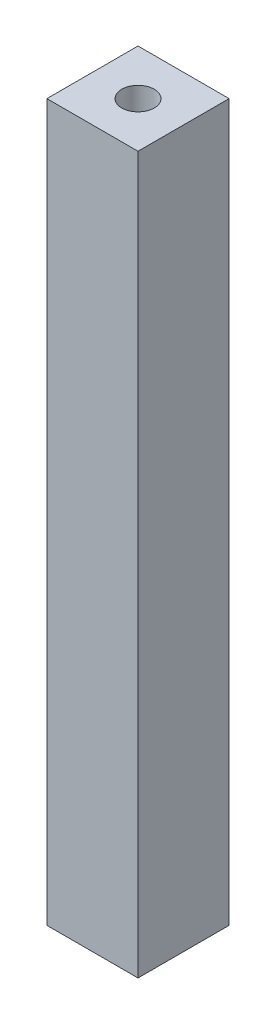
ISO-10303-21;
HEADER;
FILE_DESCRIPTION(('STEP AP214'),'2;1');
FILE_NAME('part.step','',(''),(''),'','','');
FILE_SCHEMA(('AUTOMOTIVE_DESIGN { 1 0 10303 214 1 1 1 1 }'));
ENDSEC;
DATA;
#1=APPLICATION_CONTEXT('core data for automotive mechanical design processes');
#2=APPLICATION_PROTOCOL_DEFINITION('international standard','automotive_design',2000,#1);
#3=PRODUCT_CONTEXT('',#1,'mechanical');
#4=PRODUCT('Part','Part','',(#3));
#5=PRODUCT_RELATED_PRODUCT_CATEGORY('part','',(#4));
#6=PRODUCT_DEFINITION_FORMATION('','',#4);
#7=PRODUCT_DEFINITION_CONTEXT('part definition',#1,'design');
#8=PRODUCT_DEFINITION('design','',#6,#7);
#9=PRODUCT_DEFINITION_SHAPE('','',#8);
#10=(LENGTH_UNIT() NAMED_UNIT(*) SI_UNIT(.MILLI.,.METRE.));
#11=(NAMED_UNIT(*) PLANE_ANGLE_UNIT() SI_UNIT($,.RADIAN.));
#12=(NAMED_UNIT(*) SI_UNIT($,.STERADIAN.) SOLID_ANGLE_UNIT());
#13=UNCERTAINTY_MEASURE_WITH_UNIT(LENGTH_MEASURE(1.E-05),#10,'distance_accuracy_value','');
#14=(GEOMETRIC_REPRESENTATION_CONTEXT(3) GLOBAL_UNCERTAINTY_ASSIGNED_CONTEXT((#13)) GLOBAL_UNIT_ASSIGNED_CONTEXT((#10,
#11,#12)) REPRESENTATION_CONTEXT('',''));
#15=CARTESIAN_POINT('',(0.,0.,0.));
#16=DIRECTION('',(0.,0.,1.));
#17=DIRECTION('',(1.,0.,0.));
#18=AXIS2_PLACEMENT_3D('',#15,#16,#17);
#19=CARTESIAN_POINT('',(0.,55.,-3.5));
#20=DIRECTION('',(0.,0.,1.));
#21=DIRECTION('',(1.,0.,0.));
#22=AXIS2_PLACEMENT_3D('',#19,#20,#21);
#23=PLANE('',#22);
#24=DIRECTION('',(-1.,0.,0.));
#25=VECTOR('',#24,1.);
#26=CARTESIAN_POINT('',(0.,0.,-3.5));
#27=LINE('',#26,#25);
#28=CARTESIAN_POINT('',(3.5,0.,-3.5));
#29=VERTEX_POINT('',#28);
#30=CARTESIAN_POINT('',(-3.5,0.,-3.5));
#31=VERTEX_POINT('',#30);
#32=EDGE_CURVE('E80',#29,#31,#27,.T.);
#33=ORIENTED_EDGE('',*,*,#32,.T.);
#34=DIRECTION('',(0.,-1.,0.));
#35=VECTOR('',#34,1.);
#36=CARTESIAN_POINT('',(-3.5,55.,-3.5));
#37=LINE('',#36,#35);
#38=CARTESIAN_POINT('',(-3.5,55.,-3.5));
#39=VERTEX_POINT('',#38);
#40=EDGE_CURVE('E11',#39,#31,#37,.T.);
#41=ORIENTED_EDGE('',*,*,#40,.F.);
#42=DIRECTION('',(-1.,0.,0.));
#43=VECTOR('',#42,1.);
#44=CARTESIAN_POINT('',(3.5,55.,-3.5));
#45=LINE('',#44,#43);
#46=CARTESIAN_POINT('',(3.5,55.,-3.5));
#47=VERTEX_POINT('',#46);
#48=EDGE_CURVE('E85',#47,#39,#45,.T.);
#49=ORIENTED_EDGE('',*,*,#48,.F.);
#50=DIRECTION('',(0.,-1.,0.));
#51=VECTOR('',#50,1.);
#52=CARTESIAN_POINT('',(3.5,55.,-3.5));
#53=LINE('',#52,#51);
#54=EDGE_CURVE('E104',#47,#29,#53,.T.);
#55=ORIENTED_EDGE('',*,*,#54,.T.);
#56=EDGE_LOOP('',(#33,#41,#49,#55));
#57=FACE_BOUND('',#56,.T.);
#58=ADVANCED_FACE('F39',(#57),#23,.F.);
#59=CARTESIAN_POINT('',(-3.5,55.,-3.5));
#60=DIRECTION('',(1.,0.,0.));
#61=DIRECTION('',(0.,0.,-1.));
#62=AXIS2_PLACEMENT_3D('',#59,#60,#61);
#63=PLANE('',#62);
#64=DIRECTION('',(0.,0.,1.));
#65=VECTOR('',#64,1.);
#66=CARTESIAN_POINT('',(-3.5,0.,-3.5));
#67=LINE('',#66,#65);
#68=CARTESIAN_POINT('',(-3.5,0.,3.5));
#69=VERTEX_POINT('',#68);
#70=EDGE_CURVE('E97',#31,#69,#67,.T.);
#71=ORIENTED_EDGE('',*,*,#70,.T.);
#72=DIRECTION('',(0.,-1.,0.));
#73=VECTOR('',#72,1.);
#74=CARTESIAN_POINT('',(-3.5,55.,3.5));
#75=LINE('',#74,#73);
#76=CARTESIAN_POINT('',(-3.5,55.,3.5));
#77=VERTEX_POINT('',#76);
#78=EDGE_CURVE('E48',#77,#69,#75,.T.);
#79=ORIENTED_EDGE('',*,*,#78,.F.);
#80=DIRECTION('',(0.,0.,1.));
#81=VECTOR('',#80,1.);
#82=CARTESIAN_POINT('',(-3.5,55.,-3.5));
#83=LINE('',#82,#81);
#84=EDGE_CURVE('E88',#39,#77,#83,.T.);
#85=ORIENTED_EDGE('',*,*,#84,.F.);
#86=ORIENTED_EDGE('',*,*,#40,.T.);
#87=EDGE_LOOP('',(#71,#79,#85,#86));
#88=FACE_BOUND('',#87,.T.);
#89=ADVANCED_FACE('F96',(#88),#63,.F.);
#90=CARTESIAN_POINT('',(-3.5,55.,3.5));
#91=DIRECTION('',(0.,0.,-1.));
#92=DIRECTION('',(-1.,0.,0.));
#93=AXIS2_PLACEMENT_3D('',#90,#91,#92);
#94=PLANE('',#93);
#95=DIRECTION('',(1.,0.,0.));
#96=VECTOR('',#95,1.);
#97=CARTESIAN_POINT('',(-3.5,0.,3.5));
#98=LINE('',#97,#96);
#99=CARTESIAN_POINT('',(3.5,0.,3.5));
#100=VERTEX_POINT('',#99);
#101=EDGE_CURVE('E73',#69,#100,#98,.T.);
#102=ORIENTED_EDGE('',*,*,#101,.T.);
#103=DIRECTION('',(0.,-1.,0.));
#104=VECTOR('',#103,1.);
#105=CARTESIAN_POINT('',(3.5,55.,3.5));
#106=LINE('',#105,#104);
#107=CARTESIAN_POINT('',(3.5,55.,3.5));
#108=VERTEX_POINT('',#107);
#109=EDGE_CURVE('E99',#108,#100,#106,.T.);
#110=ORIENTED_EDGE('',*,*,#109,.F.);
#111=DIRECTION('',(1.,0.,0.));
#112=VECTOR('',#111,1.);
#113=CARTESIAN_POINT('',(-3.5,55.,3.5));
#114=LINE('',#113,#112);
#115=EDGE_CURVE('E92',#77,#108,#114,.T.);
#116=ORIENTED_EDGE('',*,*,#115,.F.);
#117=ORIENTED_EDGE('',*,*,#78,.T.);
#118=EDGE_LOOP('',(#102,#110,#116,#117));
#119=FACE_BOUND('',#118,.T.);
#120=ADVANCED_FACE('F100',(#119),#94,.F.);
#121=CARTESIAN_POINT('',(3.5,55.,3.5));
#122=DIRECTION('',(-1.,0.,0.));
#123=DIRECTION('',(0.,0.,1.));
#124=AXIS2_PLACEMENT_3D('',#121,#122,#123);
#125=PLANE('',#124);
#126=DIRECTION('',(0.,0.,-1.));
#127=VECTOR('',#126,1.);
#128=CARTESIAN_POINT('',(3.5,0.,3.5));
#129=LINE('',#128,#127);
#130=EDGE_CURVE('E115',#100,#29,#129,.T.);
#131=ORIENTED_EDGE('',*,*,#130,.T.);
#132=ORIENTED_EDGE('',*,*,#54,.F.);
#133=DIRECTION('',(0.,0.,-1.));
#134=VECTOR('',#133,1.);
#135=CARTESIAN_POINT('',(3.5,55.,3.5));
#136=LINE('',#135,#134);
#137=EDGE_CURVE('E56',#108,#47,#136,.T.);
#138=ORIENTED_EDGE('',*,*,#137,.F.);
#139=ORIENTED_EDGE('',*,*,#109,.T.);
#140=EDGE_LOOP('',(#131,#132,#138,#139));
#141=FACE_BOUND('',#140,.T.);
#142=ADVANCED_FACE('F123',(#141),#125,.F.);
#143=CARTESIAN_POINT('',(0.,55.,0.));
#144=DIRECTION('',(0.,1.,0.));
#145=DIRECTION('',(0.,0.,1.));
#146=AXIS2_PLACEMENT_3D('',#143,#144,#145);
#147=PLANE('',#146);
#148=CARTESIAN_POINT('',(0.,55.,0.));
#149=DIRECTION('',(0.,1.,0.));
#150=DIRECTION('',(0.,0.,1.));
#151=AXIS2_PLACEMENT_3D('',#148,#149,#150);
#152=CIRCLE('',#151,1.25);
#153=CARTESIAN_POINT('',(0.,55.,1.25));
#154=VERTEX_POINT('',#153);
#155=EDGE_CURVE('E147',#154,#154,#152,.T.);
#156=ORIENTED_EDGE('',*,*,#155,.F.);
#157=EDGE_LOOP('',(#156));
#158=FACE_BOUND('',#157,.T.);
#159=ORIENTED_EDGE('',*,*,#48,.T.);
#160=ORIENTED_EDGE('',*,*,#84,.T.);
#161=ORIENTED_EDGE('',*,*,#115,.T.);
#162=ORIENTED_EDGE('',*,*,#137,.T.);
#163=EDGE_LOOP('',(#159,#160,#161,#162));
#164=FACE_BOUND('',#163,.T.);
#165=ADVANCED_FACE('F90',(#158,#164),#147,.T.);
#166=CARTESIAN_POINT('',(0.,0.,0.));
#167=DIRECTION('',(0.,1.,0.));
#168=DIRECTION('',(0.,0.,1.));
#169=AXIS2_PLACEMENT_3D('',#166,#167,#168);
#170=PLANE('',#169);
#171=CARTESIAN_POINT('',(0.,0.,0.));
#172=DIRECTION('',(0.,-1.,0.));
#173=DIRECTION('',(0.,0.,-1.));
#174=AXIS2_PLACEMENT_3D('',#171,#172,#173);
#175=CIRCLE('',#174,1.25);
#176=CARTESIAN_POINT('',(0.,0.,-1.25));
#177=VERTEX_POINT('',#176);
#178=EDGE_CURVE('E155',#177,#177,#175,.T.);
#179=ORIENTED_EDGE('',*,*,#178,.F.);
#180=EDGE_LOOP('',(#179));
#181=FACE_BOUND('',#180,.T.);
#182=ORIENTED_EDGE('',*,*,#32,.F.);
#183=ORIENTED_EDGE('',*,*,#130,.F.);
#184=ORIENTED_EDGE('',*,*,#101,.F.);
#185=ORIENTED_EDGE('',*,*,#70,.F.);
#186=EDGE_LOOP('',(#182,#183,#184,#185));
#187=FACE_BOUND('',#186,.T.);
#188=ADVANCED_FACE('F124',(#181,#187),#170,.F.);
#189=CARTESIAN_POINT('',(0.,43.,0.));
#190=DIRECTION('',(0.,1.,0.));
#191=DIRECTION('',(0.,0.,1.));
#192=AXIS2_PLACEMENT_3D('',#189,#190,#191);
#193=CYLINDRICAL_SURFACE('',#192,1.25);
#194=CARTESIAN_POINT('',(0.,43.,0.));
#195=DIRECTION('',(0.,1.,0.));
#196=DIRECTION('',(0.,0.,1.));
#197=AXIS2_PLACEMENT_3D('',#194,#195,#196);
#198=CIRCLE('',#197,1.25);
#199=CARTESIAN_POINT('',(0.,43.,1.25));
#200=VERTEX_POINT('',#199);
#201=EDGE_CURVE('E110',#200,#200,#198,.T.);
#202=ORIENTED_EDGE('',*,*,#201,.F.);
#203=EDGE_LOOP('',(#202));
#204=FACE_BOUND('',#203,.T.);
#205=ORIENTED_EDGE('',*,*,#155,.T.);
#206=EDGE_LOOP('',(#205));
#207=FACE_BOUND('',#206,.T.);
#208=ADVANCED_FACE('F126',(#204,#207),#193,.F.);
#209=CARTESIAN_POINT('',(0.,43.,0.));
#210=DIRECTION('',(0.,1.,0.));
#211=DIRECTION('',(0.,0.,1.));
#212=AXIS2_PLACEMENT_3D('',#209,#210,#211);
#213=PLANE('',#212);
#214=ORIENTED_EDGE('',*,*,#201,.T.);
#215=EDGE_LOOP('',(#214));
#216=FACE_BOUND('',#215,.T.);
#217=ADVANCED_FACE('F133',(#216),#213,.T.);
#218=CARTESIAN_POINT('',(0.,12.,0.));
#219=DIRECTION('',(0.,-1.,0.));
#220=DIRECTION('',(0.,0.,-1.));
#221=AXIS2_PLACEMENT_3D('',#218,#219,#220);
#222=CYLINDRICAL_SURFACE('',#221,1.25);
#223=CARTESIAN_POINT('',(0.,12.,0.));
#224=DIRECTION('',(0.,-1.,0.));
#225=DIRECTION('',(0.,0.,-1.));
#226=AXIS2_PLACEMENT_3D('',#223,#224,#225);
#227=CIRCLE('',#226,1.25);
#228=CARTESIAN_POINT('',(0.,12.,-1.25));
#229=VERTEX_POINT('',#228);
#230=EDGE_CURVE('E151',#229,#229,#227,.T.);
#231=ORIENTED_EDGE('',*,*,#230,.F.);
#232=EDGE_LOOP('',(#231));
#233=FACE_BOUND('',#232,.T.);
#234=ORIENTED_EDGE('',*,*,#178,.T.);
#235=EDGE_LOOP('',(#234));
#236=FACE_BOUND('',#235,.T.);
#237=ADVANCED_FACE('F165',(#233,#236),#222,.F.);
#238=CARTESIAN_POINT('',(0.,12.,0.));
#239=DIRECTION('',(0.,-1.,0.));
#240=DIRECTION('',(0.,0.,-1.));
#241=AXIS2_PLACEMENT_3D('',#238,#239,#240);
#242=PLANE('',#241);
#243=ORIENTED_EDGE('',*,*,#230,.T.);
#244=EDGE_LOOP('',(#243));
#245=FACE_BOUND('',#244,.T.);
#246=ADVANCED_FACE('F163',(#245),#242,.T.);
#247=CLOSED_SHELL('',(#58,#89,#120,#142,#165,#188,#208,#217,#237,#246));
#248=MANIFOLD_SOLID_BREP('B2',#247);
#249=ADVANCED_BREP_SHAPE_REPRESENTATION('',(#18,#248),#14);
#250=SHAPE_DEFINITION_REPRESENTATION(#9,#249);
ENDSEC;
END-ISO-10303-21;
